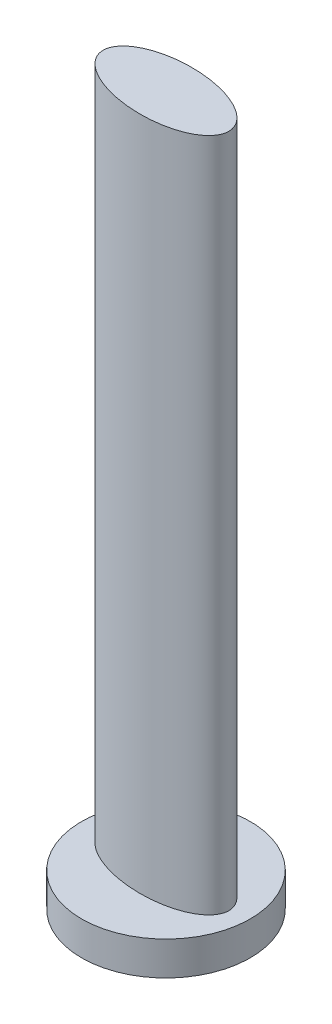
ISO-10303-21;
HEADER;
FILE_DESCRIPTION(('STEP AP214'),'2;1');
FILE_NAME('part.step','',(''),(''),'','','');
FILE_SCHEMA(('AUTOMOTIVE_DESIGN { 1 0 10303 214 1 1 1 1 }'));
ENDSEC;
DATA;
#1=APPLICATION_CONTEXT('core data for automotive mechanical design processes');
#2=APPLICATION_PROTOCOL_DEFINITION('international standard','automotive_design',2000,#1);
#3=PRODUCT_CONTEXT('',#1,'mechanical');
#4=PRODUCT('Part','Part','',(#3));
#5=PRODUCT_RELATED_PRODUCT_CATEGORY('part','',(#4));
#6=PRODUCT_DEFINITION_FORMATION('','',#4);
#7=PRODUCT_DEFINITION_CONTEXT('part definition',#1,'design');
#8=PRODUCT_DEFINITION('design','',#6,#7);
#9=PRODUCT_DEFINITION_SHAPE('','',#8);
#10=(LENGTH_UNIT() NAMED_UNIT(*) SI_UNIT(.MILLI.,.METRE.));
#11=(NAMED_UNIT(*) PLANE_ANGLE_UNIT() SI_UNIT($,.RADIAN.));
#12=(NAMED_UNIT(*) SI_UNIT($,.STERADIAN.) SOLID_ANGLE_UNIT());
#13=UNCERTAINTY_MEASURE_WITH_UNIT(LENGTH_MEASURE(1.E-05),#10,'distance_accuracy_value','');
#14=(GEOMETRIC_REPRESENTATION_CONTEXT(3) GLOBAL_UNCERTAINTY_ASSIGNED_CONTEXT((#13)) GLOBAL_UNIT_ASSIGNED_CONTEXT((#10,
#11,#12)) REPRESENTATION_CONTEXT('',''));
#15=CARTESIAN_POINT('',(0.,0.,0.));
#16=DIRECTION('',(0.,0.,1.));
#17=DIRECTION('',(1.,0.,0.));
#18=AXIS2_PLACEMENT_3D('',#15,#16,#17);
#19=CARTESIAN_POINT('',(0.,4.,0.));
#20=DIRECTION('',(0.,-1.,0.));
#21=DIRECTION('',(0.,0.,-1.));
#22=AXIS2_PLACEMENT_3D('',#19,#20,#21);
#23=CYLINDRICAL_SURFACE('',#22,10.);
#24=CARTESIAN_POINT('',(0.,4.,0.));
#25=DIRECTION('',(0.,1.,0.));
#26=DIRECTION('',(0.,0.,1.));
#27=AXIS2_PLACEMENT_3D('',#24,#25,#26);
#28=CIRCLE('',#27,10.);
#29=CARTESIAN_POINT('',(0.,4.,10.));
#30=VERTEX_POINT('',#29);
#31=EDGE_CURVE('E45',#30,#30,#28,.T.);
#32=ORIENTED_EDGE('',*,*,#31,.F.);
#33=EDGE_LOOP('',(#32));
#34=FACE_BOUND('',#33,.T.);
#35=CARTESIAN_POINT('',(0.,0.,0.));
#36=DIRECTION('',(0.,1.,0.));
#37=DIRECTION('',(0.,0.,1.));
#38=AXIS2_PLACEMENT_3D('',#35,#36,#37);
#39=CIRCLE('',#38,10.);
#40=CARTESIAN_POINT('',(0.,0.,10.));
#41=VERTEX_POINT('',#40);
#42=EDGE_CURVE('E40',#41,#41,#39,.T.);
#43=ORIENTED_EDGE('',*,*,#42,.T.);
#44=EDGE_LOOP('',(#43));
#45=FACE_BOUND('',#44,.T.);
#46=ADVANCED_FACE('F37',(#34,#45),#23,.T.);
#47=CARTESIAN_POINT('',(0.,4.,0.));
#48=DIRECTION('',(0.,1.,0.));
#49=DIRECTION('',(0.,0.,1.));
#50=AXIS2_PLACEMENT_3D('',#47,#48,#49);
#51=PLANE('',#50);
#52=CARTESIAN_POINT('',(0.,4.,0.));
#53=DIRECTION('',(0.,1.,0.));
#54=DIRECTION('',(-0.997347929888963,0.,-0.0727812252315113));
#55=AXIS2_PLACEMENT_3D('',#52,#53,#54);
#56=ELLIPSE('',#55,7.9,3.9);
#57=CARTESIAN_POINT('',(-7.87904864612281,4.,-0.574971679328939));
#58=VERTEX_POINT('',#57);
#59=EDGE_CURVE('E10',#58,#58,#56,.T.);
#60=ORIENTED_EDGE('',*,*,#59,.F.);
#61=EDGE_LOOP('',(#60));
#62=FACE_BOUND('',#61,.T.);
#63=ORIENTED_EDGE('',*,*,#31,.T.);
#64=EDGE_LOOP('',(#63));
#65=FACE_BOUND('',#64,.T.);
#66=ADVANCED_FACE('F64',(#62,#65),#51,.T.);
#67=CARTESIAN_POINT('',(0.,0.,0.));
#68=DIRECTION('',(0.,1.,0.));
#69=DIRECTION('',(0.,0.,1.));
#70=AXIS2_PLACEMENT_3D('',#67,#68,#69);
#71=PLANE('',#70);
#72=ORIENTED_EDGE('',*,*,#42,.F.);
#73=EDGE_LOOP('',(#72));
#74=FACE_BOUND('',#73,.T.);
#75=ADVANCED_FACE('F62',(#74),#71,.F.);
#76=CARTESIAN_POINT('',(0.,84.,0.));
#77=DIRECTION('',(0.,1.,0.));
#78=DIRECTION('',(-0.997347929888963,0.,-0.0727812252315113));
#79=AXIS2_PLACEMENT_3D('',#76,#77,#78);
#80=ELLIPSE('',#79,7.9,3.9);
#81=DIRECTION('',(0.,-1.,0.));
#82=VECTOR('',#81,1.);
#83=SURFACE_OF_LINEAR_EXTRUSION('',#80,#82);
#84=CARTESIAN_POINT('',(-7.87904864612281,84.,-0.574971679328939));
#85=VERTEX_POINT('',#84);
#86=EDGE_CURVE('E52',#85,#85,#80,.T.);
#87=ORIENTED_EDGE('',*,*,#86,.F.);
#88=EDGE_LOOP('',(#87));
#89=FACE_BOUND('',#88,.T.);
#90=ORIENTED_EDGE('',*,*,#59,.T.);
#91=EDGE_LOOP('',(#90));
#92=FACE_BOUND('',#91,.T.);
#93=ADVANCED_FACE('F57',(#89,#92),#83,.F.);
#94=CARTESIAN_POINT('',(0.,84.,0.));
#95=DIRECTION('',(0.,1.,0.));
#96=DIRECTION('',(0.,0.,1.));
#97=AXIS2_PLACEMENT_3D('',#94,#95,#96);
#98=PLANE('',#97);
#99=ORIENTED_EDGE('',*,*,#86,.T.);
#100=EDGE_LOOP('',(#99));
#101=FACE_BOUND('',#100,.T.);
#102=ADVANCED_FACE('F61',(#101),#98,.T.);
#103=CLOSED_SHELL('',(#46,#66,#75,#93,#102));
#104=MANIFOLD_SOLID_BREP('B2',#103);
#105=ADVANCED_BREP_SHAPE_REPRESENTATION('',(#18,#104),#14);
#106=SHAPE_DEFINITION_REPRESENTATION(#9,#105);
ENDSEC;
END-ISO-10303-21;
